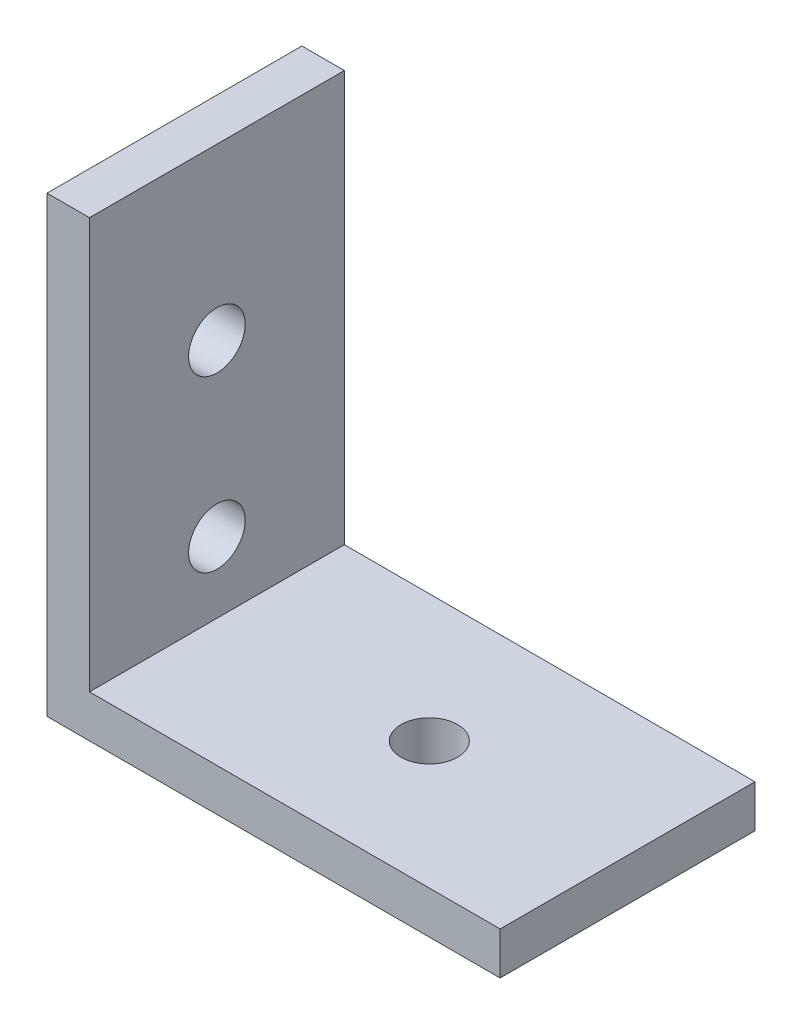
ISO-10303-21;
HEADER;
FILE_DESCRIPTION(('STEP AP214'),'2;1');
FILE_NAME('part.step','',(''),(''),'','','');
FILE_SCHEMA(('AUTOMOTIVE_DESIGN { 1 0 10303 214 1 1 1 1 }'));
ENDSEC;
DATA;
#1=APPLICATION_CONTEXT('core data for automotive mechanical design processes');
#2=APPLICATION_PROTOCOL_DEFINITION('international standard','automotive_design',2000,#1);
#3=PRODUCT_CONTEXT('',#1,'mechanical');
#4=PRODUCT('Part','Part','',(#3));
#5=PRODUCT_RELATED_PRODUCT_CATEGORY('part','',(#4));
#6=PRODUCT_DEFINITION_FORMATION('','',#4);
#7=PRODUCT_DEFINITION_CONTEXT('part definition',#1,'design');
#8=PRODUCT_DEFINITION('design','',#6,#7);
#9=PRODUCT_DEFINITION_SHAPE('','',#8);
#10=(LENGTH_UNIT() NAMED_UNIT(*) SI_UNIT(.MILLI.,.METRE.));
#11=(NAMED_UNIT(*) PLANE_ANGLE_UNIT() SI_UNIT($,.RADIAN.));
#12=(NAMED_UNIT(*) SI_UNIT($,.STERADIAN.) SOLID_ANGLE_UNIT());
#13=UNCERTAINTY_MEASURE_WITH_UNIT(LENGTH_MEASURE(1.E-05),#10,'distance_accuracy_value','');
#14=(GEOMETRIC_REPRESENTATION_CONTEXT(3) GLOBAL_UNCERTAINTY_ASSIGNED_CONTEXT((#13)) GLOBAL_UNIT_ASSIGNED_CONTEXT((#10,
#11,#12)) REPRESENTATION_CONTEXT('',''));
#15=CARTESIAN_POINT('',(0.,0.,0.));
#16=DIRECTION('',(0.,0.,1.));
#17=DIRECTION('',(1.,0.,0.));
#18=AXIS2_PLACEMENT_3D('',#15,#16,#17);
#19=CARTESIAN_POINT('',(0.,3.,0.));
#20=DIRECTION('',(0.,-1.,0.));
#21=DIRECTION('',(0.,0.,-1.));
#22=AXIS2_PLACEMENT_3D('',#19,#20,#21);
#23=PLANE('',#22);
#24=CARTESIAN_POINT('',(18.,3.,-9.));
#25=DIRECTION('',(0.,1.,0.));
#26=DIRECTION('',(0.,0.,1.));
#27=AXIS2_PLACEMENT_3D('',#24,#25,#26);
#28=CIRCLE('',#27,2.);
#29=CARTESIAN_POINT('',(18.,3.,-7.));
#30=VERTEX_POINT('',#29);
#31=EDGE_CURVE('E280',#30,#30,#28,.T.);
#32=ORIENTED_EDGE('',*,*,#31,.F.);
#33=EDGE_LOOP('',(#32));
#34=FACE_BOUND('',#33,.T.);
#35=DIRECTION('',(0.,0.,-1.));
#36=VECTOR('',#35,1.);
#37=CARTESIAN_POINT('',(3.,3.,0.));
#38=LINE('',#37,#36);
#39=CARTESIAN_POINT('',(3.,3.,0.));
#40=VERTEX_POINT('',#39);
#41=CARTESIAN_POINT('',(3.,3.,-18.));
#42=VERTEX_POINT('',#41);
#43=EDGE_CURVE('E98',#40,#42,#38,.T.);
#44=ORIENTED_EDGE('',*,*,#43,.F.);
#45=DIRECTION('',(1.,0.,0.));
#46=VECTOR('',#45,1.);
#47=CARTESIAN_POINT('',(0.,3.,0.));
#48=LINE('',#47,#46);
#49=CARTESIAN_POINT('',(32.,3.,0.));
#50=VERTEX_POINT('',#49);
#51=EDGE_CURVE('E135',#40,#50,#48,.T.);
#52=ORIENTED_EDGE('',*,*,#51,.T.);
#53=DIRECTION('',(0.,0.,-1.));
#54=VECTOR('',#53,1.);
#55=CARTESIAN_POINT('',(32.,3.,0.));
#56=LINE('',#55,#54);
#57=CARTESIAN_POINT('',(32.,3.,-18.));
#58=VERTEX_POINT('',#57);
#59=EDGE_CURVE('E102',#50,#58,#56,.T.);
#60=ORIENTED_EDGE('',*,*,#59,.T.);
#61=DIRECTION('',(-1.,0.,0.));
#62=VECTOR('',#61,1.);
#63=CARTESIAN_POINT('',(0.,3.,-18.));
#64=LINE('',#63,#62);
#65=EDGE_CURVE('E144',#58,#42,#64,.T.);
#66=ORIENTED_EDGE('',*,*,#65,.T.);
#67=EDGE_LOOP('',(#44,#52,#60,#66));
#68=FACE_BOUND('',#67,.T.);
#69=ADVANCED_FACE('F81',(#34,#68),#23,.F.);
#70=CARTESIAN_POINT('',(0.,3.,0.));
#71=DIRECTION('',(1.,0.,0.));
#72=DIRECTION('',(0.,0.,-1.));
#73=AXIS2_PLACEMENT_3D('',#70,#71,#72);
#74=PLANE('',#73);
#75=CARTESIAN_POINT('',(0.,20.,-9.));
#76=DIRECTION('',(1.,0.,0.));
#77=DIRECTION('',(0.,0.,-1.));
#78=AXIS2_PLACEMENT_3D('',#75,#76,#77);
#79=CIRCLE('',#78,2.);
#80=CARTESIAN_POINT('',(0.,20.,-11.));
#81=VERTEX_POINT('',#80);
#82=EDGE_CURVE('E269',#81,#81,#79,.T.);
#83=ORIENTED_EDGE('',*,*,#82,.T.);
#84=EDGE_LOOP('',(#83));
#85=FACE_BOUND('',#84,.T.);
#86=CARTESIAN_POINT('',(0.,8.,-9.));
#87=DIRECTION('',(1.,0.,0.));
#88=DIRECTION('',(0.,0.,-1.));
#89=AXIS2_PLACEMENT_3D('',#86,#87,#88);
#90=CIRCLE('',#89,2.);
#91=CARTESIAN_POINT('',(0.,8.,-11.));
#92=VERTEX_POINT('',#91);
#93=EDGE_CURVE('E278',#92,#92,#90,.T.);
#94=ORIENTED_EDGE('',*,*,#93,.T.);
#95=EDGE_LOOP('',(#94));
#96=FACE_BOUND('',#95,.T.);
#97=DIRECTION('',(0.,0.,1.));
#98=VECTOR('',#97,1.);
#99=CARTESIAN_POINT('',(0.,0.,0.));
#100=LINE('',#99,#98);
#101=CARTESIAN_POINT('',(0.,0.,-18.));
#102=VERTEX_POINT('',#101);
#103=CARTESIAN_POINT('',(0.,0.,0.));
#104=VERTEX_POINT('',#103);
#105=EDGE_CURVE('E142',#102,#104,#100,.T.);
#106=ORIENTED_EDGE('',*,*,#105,.T.);
#107=DIRECTION('',(0.,-1.,0.));
#108=VECTOR('',#107,1.);
#109=CARTESIAN_POINT('',(0.,3.,0.));
#110=LINE('',#109,#108);
#111=CARTESIAN_POINT('',(0.,32.,0.));
#112=VERTEX_POINT('',#111);
#113=EDGE_CURVE('E14',#112,#104,#110,.T.);
#114=ORIENTED_EDGE('',*,*,#113,.F.);
#115=DIRECTION('',(0.,0.,1.));
#116=VECTOR('',#115,1.);
#117=CARTESIAN_POINT('',(0.,32.,0.));
#118=LINE('',#117,#116);
#119=CARTESIAN_POINT('',(0.,32.,-18.));
#120=VERTEX_POINT('',#119);
#121=EDGE_CURVE('E145',#120,#112,#118,.T.);
#122=ORIENTED_EDGE('',*,*,#121,.F.);
#123=DIRECTION('',(0.,-1.,0.));
#124=VECTOR('',#123,1.);
#125=CARTESIAN_POINT('',(0.,3.,-18.));
#126=LINE('',#125,#124);
#127=EDGE_CURVE('E126',#120,#102,#126,.T.);
#128=ORIENTED_EDGE('',*,*,#127,.T.);
#129=EDGE_LOOP('',(#106,#114,#122,#128));
#130=FACE_BOUND('',#129,.T.);
#131=ADVANCED_FACE('F82',(#85,#96,#130),#74,.F.);
#132=CARTESIAN_POINT('',(0.,3.,0.));
#133=DIRECTION('',(0.,0.,-1.));
#134=DIRECTION('',(-1.,0.,0.));
#135=AXIS2_PLACEMENT_3D('',#132,#133,#134);
#136=PLANE('',#135);
#137=DIRECTION('',(1.,0.,0.));
#138=VECTOR('',#137,1.);
#139=CARTESIAN_POINT('',(0.,0.,0.));
#140=LINE('',#139,#138);
#141=CARTESIAN_POINT('',(32.,0.,0.));
#142=VERTEX_POINT('',#141);
#143=EDGE_CURVE('E146',#104,#142,#140,.T.);
#144=ORIENTED_EDGE('',*,*,#143,.T.);
#145=DIRECTION('',(0.,-1.,0.));
#146=VECTOR('',#145,1.);
#147=CARTESIAN_POINT('',(32.,3.,0.));
#148=LINE('',#147,#146);
#149=EDGE_CURVE('E93',#50,#142,#148,.T.);
#150=ORIENTED_EDGE('',*,*,#149,.F.);
#151=ORIENTED_EDGE('',*,*,#51,.F.);
#152=DIRECTION('',(0.,-1.,0.));
#153=VECTOR('',#152,1.);
#154=CARTESIAN_POINT('',(3.,32.,0.));
#155=LINE('',#154,#153);
#156=CARTESIAN_POINT('',(3.,32.,0.));
#157=VERTEX_POINT('',#156);
#158=EDGE_CURVE('E149',#157,#40,#155,.T.);
#159=ORIENTED_EDGE('',*,*,#158,.F.);
#160=DIRECTION('',(1.,0.,0.));
#161=VECTOR('',#160,1.);
#162=CARTESIAN_POINT('',(0.,32.,0.));
#163=LINE('',#162,#161);
#164=EDGE_CURVE('E166',#112,#157,#163,.T.);
#165=ORIENTED_EDGE('',*,*,#164,.F.);
#166=ORIENTED_EDGE('',*,*,#113,.T.);
#167=EDGE_LOOP('',(#144,#150,#151,#159,#165,#166));
#168=FACE_BOUND('',#167,.T.);
#169=ADVANCED_FACE('F163',(#168),#136,.F.);
#170=CARTESIAN_POINT('',(32.,3.,0.));
#171=DIRECTION('',(-1.,0.,0.));
#172=DIRECTION('',(0.,0.,1.));
#173=AXIS2_PLACEMENT_3D('',#170,#171,#172);
#174=PLANE('',#173);
#175=DIRECTION('',(0.,0.,-1.));
#176=VECTOR('',#175,1.);
#177=CARTESIAN_POINT('',(32.,0.,0.));
#178=LINE('',#177,#176);
#179=CARTESIAN_POINT('',(32.,0.,-18.));
#180=VERTEX_POINT('',#179);
#181=EDGE_CURVE('E138',#142,#180,#178,.T.);
#182=ORIENTED_EDGE('',*,*,#181,.T.);
#183=DIRECTION('',(0.,-1.,0.));
#184=VECTOR('',#183,1.);
#185=CARTESIAN_POINT('',(32.,3.,-18.));
#186=LINE('',#185,#184);
#187=EDGE_CURVE('E131',#58,#180,#186,.T.);
#188=ORIENTED_EDGE('',*,*,#187,.F.);
#189=ORIENTED_EDGE('',*,*,#59,.F.);
#190=ORIENTED_EDGE('',*,*,#149,.T.);
#191=EDGE_LOOP('',(#182,#188,#189,#190));
#192=FACE_BOUND('',#191,.T.);
#193=ADVANCED_FACE('F165',(#192),#174,.F.);
#194=CARTESIAN_POINT('',(0.,3.,-18.));
#195=DIRECTION('',(0.,0.,1.));
#196=DIRECTION('',(1.,0.,0.));
#197=AXIS2_PLACEMENT_3D('',#194,#195,#196);
#198=PLANE('',#197);
#199=DIRECTION('',(-1.,0.,0.));
#200=VECTOR('',#199,1.);
#201=CARTESIAN_POINT('',(0.,0.,-18.));
#202=LINE('',#201,#200);
#203=EDGE_CURVE('E121',#180,#102,#202,.T.);
#204=ORIENTED_EDGE('',*,*,#203,.T.);
#205=ORIENTED_EDGE('',*,*,#127,.F.);
#206=DIRECTION('',(-1.,0.,0.));
#207=VECTOR('',#206,1.);
#208=CARTESIAN_POINT('',(0.,32.,-18.));
#209=LINE('',#208,#207);
#210=CARTESIAN_POINT('',(3.,32.,-18.));
#211=VERTEX_POINT('',#210);
#212=EDGE_CURVE('E181',#211,#120,#209,.T.);
#213=ORIENTED_EDGE('',*,*,#212,.F.);
#214=DIRECTION('',(0.,-1.,0.));
#215=VECTOR('',#214,1.);
#216=CARTESIAN_POINT('',(3.,32.,-18.));
#217=LINE('',#216,#215);
#218=EDGE_CURVE('E153',#211,#42,#217,.T.);
#219=ORIENTED_EDGE('',*,*,#218,.T.);
#220=ORIENTED_EDGE('',*,*,#65,.F.);
#221=ORIENTED_EDGE('',*,*,#187,.T.);
#222=EDGE_LOOP('',(#204,#205,#213,#219,#220,#221));
#223=FACE_BOUND('',#222,.T.);
#224=ADVANCED_FACE('F127',(#223),#198,.F.);
#225=CARTESIAN_POINT('',(0.,0.,0.));
#226=DIRECTION('',(0.,-1.,0.));
#227=DIRECTION('',(0.,0.,-1.));
#228=AXIS2_PLACEMENT_3D('',#225,#226,#227);
#229=PLANE('',#228);
#230=CARTESIAN_POINT('',(18.,0.,-9.));
#231=DIRECTION('',(0.,1.,0.));
#232=DIRECTION('',(0.,0.,1.));
#233=AXIS2_PLACEMENT_3D('',#230,#231,#232);
#234=CIRCLE('',#233,2.);
#235=CARTESIAN_POINT('',(18.,0.,-7.));
#236=VERTEX_POINT('',#235);
#237=EDGE_CURVE('E195',#236,#236,#234,.T.);
#238=ORIENTED_EDGE('',*,*,#237,.T.);
#239=EDGE_LOOP('',(#238));
#240=FACE_BOUND('',#239,.T.);
#241=ORIENTED_EDGE('',*,*,#105,.F.);
#242=ORIENTED_EDGE('',*,*,#203,.F.);
#243=ORIENTED_EDGE('',*,*,#181,.F.);
#244=ORIENTED_EDGE('',*,*,#143,.F.);
#245=EDGE_LOOP('',(#241,#242,#243,#244));
#246=FACE_BOUND('',#245,.T.);
#247=ADVANCED_FACE('F150',(#240,#246),#229,.T.);
#248=CARTESIAN_POINT('',(3.,32.,0.));
#249=DIRECTION('',(-1.,0.,0.));
#250=DIRECTION('',(0.,0.,1.));
#251=AXIS2_PLACEMENT_3D('',#248,#249,#250);
#252=PLANE('',#251);
#253=CARTESIAN_POINT('',(3.,20.,-9.));
#254=DIRECTION('',(1.,0.,0.));
#255=DIRECTION('',(0.,0.,-1.));
#256=AXIS2_PLACEMENT_3D('',#253,#254,#255);
#257=CIRCLE('',#256,2.);
#258=CARTESIAN_POINT('',(3.,20.,-11.));
#259=VERTEX_POINT('',#258);
#260=EDGE_CURVE('E272',#259,#259,#257,.T.);
#261=ORIENTED_EDGE('',*,*,#260,.F.);
#262=EDGE_LOOP('',(#261));
#263=FACE_BOUND('',#262,.T.);
#264=CARTESIAN_POINT('',(3.,8.,-9.));
#265=DIRECTION('',(1.,0.,0.));
#266=DIRECTION('',(0.,0.,-1.));
#267=AXIS2_PLACEMENT_3D('',#264,#265,#266);
#268=CIRCLE('',#267,2.);
#269=CARTESIAN_POINT('',(3.,8.,-11.));
#270=VERTEX_POINT('',#269);
#271=EDGE_CURVE('E274',#270,#270,#268,.T.);
#272=ORIENTED_EDGE('',*,*,#271,.F.);
#273=EDGE_LOOP('',(#272));
#274=FACE_BOUND('',#273,.T.);
#275=ORIENTED_EDGE('',*,*,#43,.T.);
#276=ORIENTED_EDGE('',*,*,#218,.F.);
#277=DIRECTION('',(0.,0.,-1.));
#278=VECTOR('',#277,1.);
#279=CARTESIAN_POINT('',(3.,32.,0.));
#280=LINE('',#279,#278);
#281=EDGE_CURVE('E178',#157,#211,#280,.T.);
#282=ORIENTED_EDGE('',*,*,#281,.F.);
#283=ORIENTED_EDGE('',*,*,#158,.T.);
#284=EDGE_LOOP('',(#275,#276,#282,#283));
#285=FACE_BOUND('',#284,.T.);
#286=ADVANCED_FACE('F187',(#263,#274,#285),#252,.F.);
#287=CARTESIAN_POINT('',(0.,32.,0.));
#288=DIRECTION('',(0.,-1.,0.));
#289=DIRECTION('',(0.,0.,-1.));
#290=AXIS2_PLACEMENT_3D('',#287,#288,#289);
#291=PLANE('',#290);
#292=ORIENTED_EDGE('',*,*,#121,.T.);
#293=ORIENTED_EDGE('',*,*,#164,.T.);
#294=ORIENTED_EDGE('',*,*,#281,.T.);
#295=ORIENTED_EDGE('',*,*,#212,.T.);
#296=EDGE_LOOP('',(#292,#293,#294,#295));
#297=FACE_BOUND('',#296,.T.);
#298=ADVANCED_FACE('F185',(#297),#291,.F.);
#299=CARTESIAN_POINT('',(18.,0.,-9.));
#300=DIRECTION('',(0.,1.,0.));
#301=DIRECTION('',(0.,0.,1.));
#302=AXIS2_PLACEMENT_3D('',#299,#300,#301);
#303=CYLINDRICAL_SURFACE('',#302,2.);
#304=ORIENTED_EDGE('',*,*,#237,.F.);
#305=EDGE_LOOP('',(#304));
#306=FACE_BOUND('',#305,.T.);
#307=ORIENTED_EDGE('',*,*,#31,.T.);
#308=EDGE_LOOP('',(#307));
#309=FACE_BOUND('',#308,.T.);
#310=ADVANCED_FACE('F228',(#306,#309),#303,.F.);
#311=CARTESIAN_POINT('',(0.,8.,-9.));
#312=DIRECTION('',(1.,0.,0.));
#313=DIRECTION('',(0.,0.,-1.));
#314=AXIS2_PLACEMENT_3D('',#311,#312,#313);
#315=CYLINDRICAL_SURFACE('',#314,2.);
#316=ORIENTED_EDGE('',*,*,#93,.F.);
#317=EDGE_LOOP('',(#316));
#318=FACE_BOUND('',#317,.T.);
#319=ORIENTED_EDGE('',*,*,#271,.T.);
#320=EDGE_LOOP('',(#319));
#321=FACE_BOUND('',#320,.T.);
#322=ADVANCED_FACE('F243',(#318,#321),#315,.F.);
#323=CARTESIAN_POINT('',(0.,20.,-9.));
#324=DIRECTION('',(1.,0.,0.));
#325=DIRECTION('',(0.,0.,-1.));
#326=AXIS2_PLACEMENT_3D('',#323,#324,#325);
#327=CYLINDRICAL_SURFACE('',#326,2.);
#328=ORIENTED_EDGE('',*,*,#82,.F.);
#329=EDGE_LOOP('',(#328));
#330=FACE_BOUND('',#329,.T.);
#331=ORIENTED_EDGE('',*,*,#260,.T.);
#332=EDGE_LOOP('',(#331));
#333=FACE_BOUND('',#332,.T.);
#334=ADVANCED_FACE('F255',(#330,#333),#327,.F.);
#335=CLOSED_SHELL('',(#69,#131,#169,#193,#224,#247,#286,#298,#310,#322,#334));
#336=MANIFOLD_SOLID_BREP('B2',#335);
#337=ADVANCED_BREP_SHAPE_REPRESENTATION('',(#18,#336),#14);
#338=SHAPE_DEFINITION_REPRESENTATION(#9,#337);
ENDSEC;
END-ISO-10303-21;
